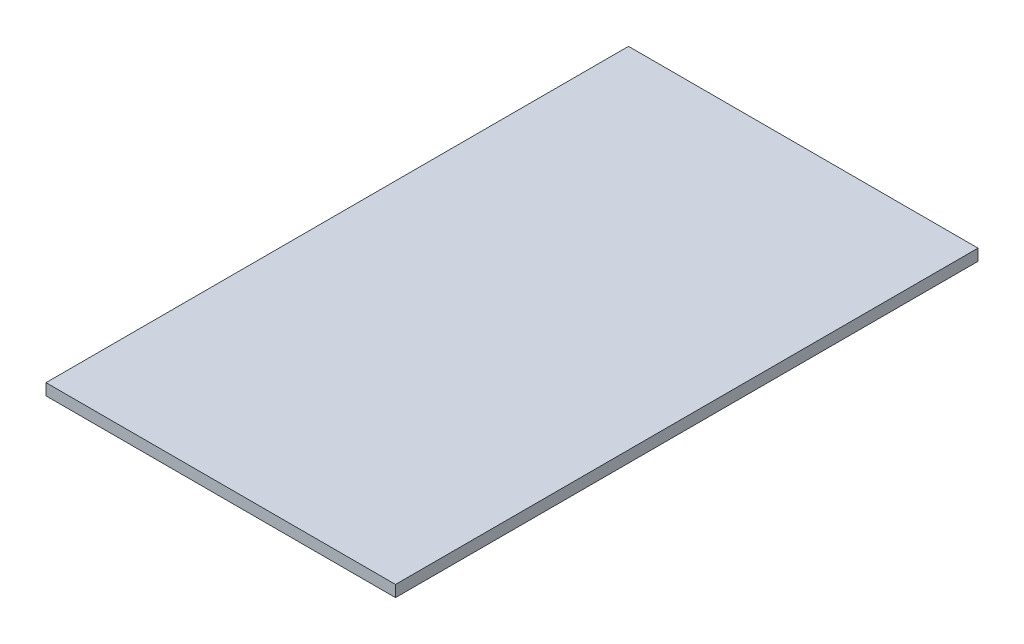
ISO-10303-21;
HEADER;
FILE_DESCRIPTION(('STEP AP214'),'2;1');
FILE_NAME('part.step','',(''),(''),'','','');
FILE_SCHEMA(('AUTOMOTIVE_DESIGN { 1 0 10303 214 1 1 1 1 }'));
ENDSEC;
DATA;
#1=APPLICATION_CONTEXT('core data for automotive mechanical design processes');
#2=APPLICATION_PROTOCOL_DEFINITION('international standard','automotive_design',2000,#1);
#3=PRODUCT_CONTEXT('',#1,'mechanical');
#4=PRODUCT('Part','Part','',(#3));
#5=PRODUCT_RELATED_PRODUCT_CATEGORY('part','',(#4));
#6=PRODUCT_DEFINITION_FORMATION('','',#4);
#7=PRODUCT_DEFINITION_CONTEXT('part definition',#1,'design');
#8=PRODUCT_DEFINITION('design','',#6,#7);
#9=PRODUCT_DEFINITION_SHAPE('','',#8);
#10=(LENGTH_UNIT() NAMED_UNIT(*) SI_UNIT(.MILLI.,.METRE.));
#11=(NAMED_UNIT(*) PLANE_ANGLE_UNIT() SI_UNIT($,.RADIAN.));
#12=(NAMED_UNIT(*) SI_UNIT($,.STERADIAN.) SOLID_ANGLE_UNIT());
#13=UNCERTAINTY_MEASURE_WITH_UNIT(LENGTH_MEASURE(1.E-05),#10,'distance_accuracy_value','');
#14=(GEOMETRIC_REPRESENTATION_CONTEXT(3) GLOBAL_UNCERTAINTY_ASSIGNED_CONTEXT((#13)) GLOBAL_UNIT_ASSIGNED_CONTEXT((#10,
#11,#12)) REPRESENTATION_CONTEXT('',''));
#15=CARTESIAN_POINT('',(0.,0.,0.));
#16=DIRECTION('',(0.,0.,1.));
#17=DIRECTION('',(1.,0.,0.));
#18=AXIS2_PLACEMENT_3D('',#15,#16,#17);
#19=CARTESIAN_POINT('',(0.,0.,0.));
#20=DIRECTION('',(0.,1.,0.));
#21=DIRECTION('',(0.,0.,1.));
#22=AXIS2_PLACEMENT_3D('',#19,#20,#21);
#23=PLANE('',#22);
#24=DIRECTION('',(1.,0.,0.));
#25=VECTOR('',#24,1.);
#26=CARTESIAN_POINT('',(15.24,0.,-25.4));
#27=LINE('',#26,#25);
#28=CARTESIAN_POINT('',(-15.24,0.,-25.4));
#29=VERTEX_POINT('',#28);
#30=CARTESIAN_POINT('',(15.24,0.,-25.4));
#31=VERTEX_POINT('',#30);
#32=EDGE_CURVE('E80',#29,#31,#27,.T.);
#33=ORIENTED_EDGE('',*,*,#32,.T.);
#34=DIRECTION('',(0.,0.,1.));
#35=VECTOR('',#34,1.);
#36=CARTESIAN_POINT('',(15.24,0.,25.4));
#37=LINE('',#36,#35);
#38=CARTESIAN_POINT('',(15.24,0.,25.4));
#39=VERTEX_POINT('',#38);
#40=EDGE_CURVE('E67',#31,#39,#37,.T.);
#41=ORIENTED_EDGE('',*,*,#40,.T.);
#42=DIRECTION('',(-1.,0.,0.));
#43=VECTOR('',#42,1.);
#44=CARTESIAN_POINT('',(15.24,0.,25.4));
#45=LINE('',#44,#43);
#46=CARTESIAN_POINT('',(-15.24,0.,25.4));
#47=VERTEX_POINT('',#46);
#48=EDGE_CURVE('E54',#39,#47,#45,.T.);
#49=ORIENTED_EDGE('',*,*,#48,.T.);
#50=DIRECTION('',(0.,0.,-1.));
#51=VECTOR('',#50,1.);
#52=CARTESIAN_POINT('',(-15.24,0.,25.4));
#53=LINE('',#52,#51);
#54=EDGE_CURVE('E19',#47,#29,#53,.T.);
#55=ORIENTED_EDGE('',*,*,#54,.T.);
#56=EDGE_LOOP('',(#33,#41,#49,#55));
#57=FACE_BOUND('',#56,.T.);
#58=ADVANCED_FACE('F16',(#57),#23,.F.);
#59=CARTESIAN_POINT('',(-15.24,1.,25.4));
#60=DIRECTION('',(1.,0.,0.));
#61=DIRECTION('',(0.,0.,-1.));
#62=AXIS2_PLACEMENT_3D('',#59,#60,#61);
#63=PLANE('',#62);
#64=DIRECTION('',(0.,1.,0.));
#65=VECTOR('',#64,1.);
#66=CARTESIAN_POINT('',(-15.24,1.,25.4));
#67=LINE('',#66,#65);
#68=CARTESIAN_POINT('',(-15.24,1.,25.4));
#69=VERTEX_POINT('',#68);
#70=EDGE_CURVE('E60',#47,#69,#67,.T.);
#71=ORIENTED_EDGE('',*,*,#70,.T.);
#72=DIRECTION('',(0.,0.,1.));
#73=VECTOR('',#72,1.);
#74=CARTESIAN_POINT('',(-15.24,1.,0.));
#75=LINE('',#74,#73);
#76=CARTESIAN_POINT('',(-15.24,1.,-25.4));
#77=VERTEX_POINT('',#76);
#78=EDGE_CURVE('E82',#77,#69,#75,.T.);
#79=ORIENTED_EDGE('',*,*,#78,.F.);
#80=DIRECTION('',(0.,1.,0.));
#81=VECTOR('',#80,1.);
#82=CARTESIAN_POINT('',(-15.24,1.,-25.4));
#83=LINE('',#82,#81);
#84=EDGE_CURVE('E63',#77,#29,#83,.F.);
#85=ORIENTED_EDGE('',*,*,#84,.T.);
#86=ORIENTED_EDGE('',*,*,#54,.F.);
#87=EDGE_LOOP('',(#71,#79,#85,#86));
#88=FACE_BOUND('',#87,.T.);
#89=ADVANCED_FACE('F59',(#88),#63,.F.);
#90=CARTESIAN_POINT('',(15.24,1.,25.4));
#91=DIRECTION('',(0.,0.,-1.));
#92=DIRECTION('',(-1.,0.,0.));
#93=AXIS2_PLACEMENT_3D('',#90,#91,#92);
#94=PLANE('',#93);
#95=DIRECTION('',(0.,1.,0.));
#96=VECTOR('',#95,1.);
#97=CARTESIAN_POINT('',(15.24,1.,25.4));
#98=LINE('',#97,#96);
#99=CARTESIAN_POINT('',(15.24,1.,25.4));
#100=VERTEX_POINT('',#99);
#101=EDGE_CURVE('E69',#39,#100,#98,.T.);
#102=ORIENTED_EDGE('',*,*,#101,.T.);
#103=DIRECTION('',(1.,0.,0.));
#104=VECTOR('',#103,1.);
#105=CARTESIAN_POINT('',(0.,1.,25.4));
#106=LINE('',#105,#104);
#107=EDGE_CURVE('E73',#69,#100,#106,.T.);
#108=ORIENTED_EDGE('',*,*,#107,.F.);
#109=ORIENTED_EDGE('',*,*,#70,.F.);
#110=ORIENTED_EDGE('',*,*,#48,.F.);
#111=EDGE_LOOP('',(#102,#108,#109,#110));
#112=FACE_BOUND('',#111,.T.);
#113=ADVANCED_FACE('F71',(#112),#94,.F.);
#114=CARTESIAN_POINT('',(15.24,1.,25.4));
#115=DIRECTION('',(-1.,0.,0.));
#116=DIRECTION('',(0.,0.,1.));
#117=AXIS2_PLACEMENT_3D('',#114,#115,#116);
#118=PLANE('',#117);
#119=DIRECTION('',(0.,1.,0.));
#120=VECTOR('',#119,1.);
#121=CARTESIAN_POINT('',(15.24,1.,-25.4));
#122=LINE('',#121,#120);
#123=CARTESIAN_POINT('',(15.24,1.,-25.4));
#124=VERTEX_POINT('',#123);
#125=EDGE_CURVE('E34',#31,#124,#122,.T.);
#126=ORIENTED_EDGE('',*,*,#125,.T.);
#127=DIRECTION('',(0.,0.,1.));
#128=VECTOR('',#127,1.);
#129=CARTESIAN_POINT('',(15.24,1.,0.));
#130=LINE('',#129,#128);
#131=EDGE_CURVE('E25',#100,#124,#130,.F.);
#132=ORIENTED_EDGE('',*,*,#131,.F.);
#133=ORIENTED_EDGE('',*,*,#101,.F.);
#134=ORIENTED_EDGE('',*,*,#40,.F.);
#135=EDGE_LOOP('',(#126,#132,#133,#134));
#136=FACE_BOUND('',#135,.T.);
#137=ADVANCED_FACE('F88',(#136),#118,.F.);
#138=CARTESIAN_POINT('',(15.24,1.,-25.4));
#139=DIRECTION('',(0.,0.,1.));
#140=DIRECTION('',(1.,0.,0.));
#141=AXIS2_PLACEMENT_3D('',#138,#139,#140);
#142=PLANE('',#141);
#143=ORIENTED_EDGE('',*,*,#84,.F.);
#144=DIRECTION('',(1.,0.,0.));
#145=VECTOR('',#144,1.);
#146=CARTESIAN_POINT('',(0.,1.,-25.4));
#147=LINE('',#146,#145);
#148=EDGE_CURVE('E11',#124,#77,#147,.F.);
#149=ORIENTED_EDGE('',*,*,#148,.F.);
#150=ORIENTED_EDGE('',*,*,#125,.F.);
#151=ORIENTED_EDGE('',*,*,#32,.F.);
#152=EDGE_LOOP('',(#143,#149,#150,#151));
#153=FACE_BOUND('',#152,.T.);
#154=ADVANCED_FACE('F90',(#153),#142,.F.);
#155=CARTESIAN_POINT('',(0.,1.,0.));
#156=DIRECTION('',(0.,1.,0.));
#157=DIRECTION('',(0.,0.,1.));
#158=AXIS2_PLACEMENT_3D('',#155,#156,#157);
#159=PLANE('',#158);
#160=ORIENTED_EDGE('',*,*,#131,.T.);
#161=ORIENTED_EDGE('',*,*,#148,.T.);
#162=ORIENTED_EDGE('',*,*,#78,.T.);
#163=ORIENTED_EDGE('',*,*,#107,.T.);
#164=EDGE_LOOP('',(#160,#161,#162,#163));
#165=FACE_BOUND('',#164,.T.);
#166=ADVANCED_FACE('F87',(#165),#159,.T.);
#167=CLOSED_SHELL('',(#58,#89,#113,#137,#154,#166));
#168=MANIFOLD_SOLID_BREP('B1',#167);
#169=ADVANCED_BREP_SHAPE_REPRESENTATION('',(#18,#168),#14);
#170=SHAPE_DEFINITION_REPRESENTATION(#9,#169);
ENDSEC;
END-ISO-10303-21;
